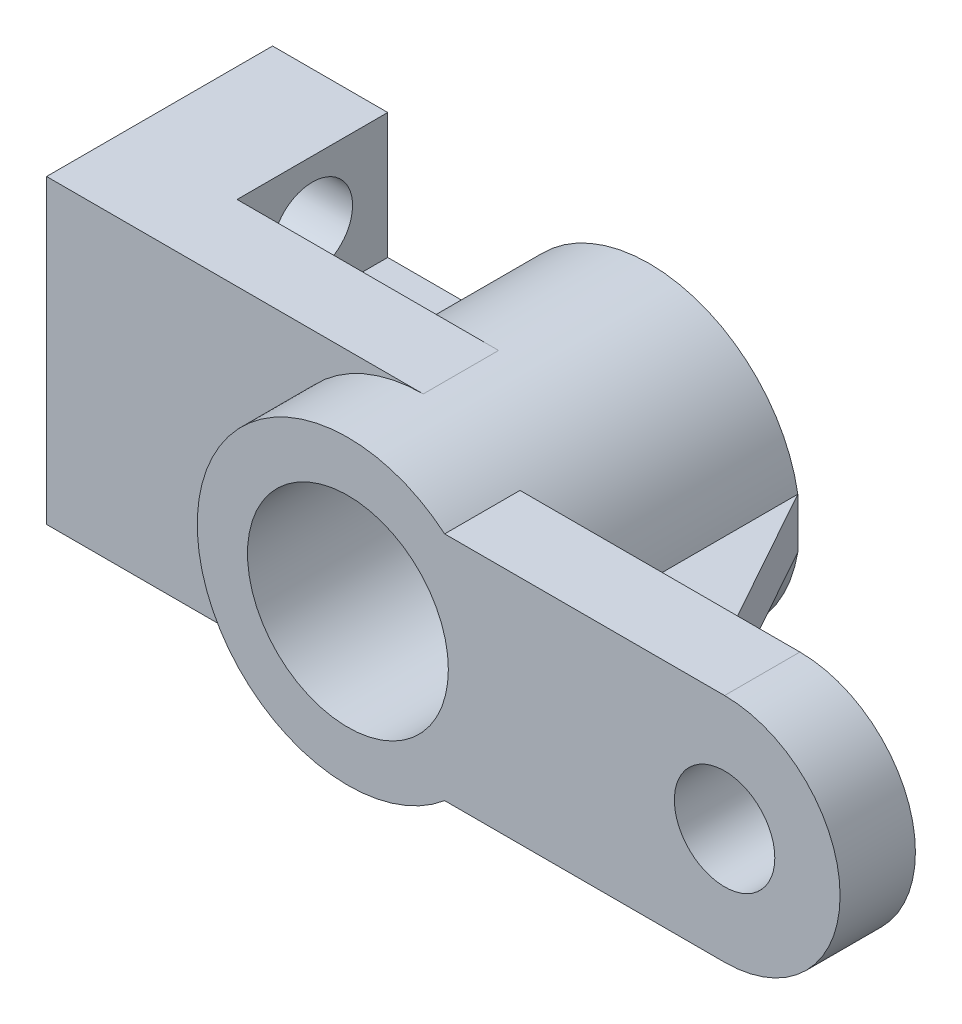
ISO-10303-21;
HEADER;
FILE_DESCRIPTION(('STEP AP214'),'2;1');
FILE_NAME('part.step','',(''),(''),'','','');
FILE_SCHEMA(('AUTOMOTIVE_DESIGN { 1 0 10303 214 1 1 1 1 }'));
ENDSEC;
DATA;
#1=APPLICATION_CONTEXT('core data for automotive mechanical design processes');
#2=APPLICATION_PROTOCOL_DEFINITION('international standard','automotive_design',2000,#1);
#3=PRODUCT_CONTEXT('',#1,'mechanical');
#4=PRODUCT('Part','Part','',(#3));
#5=PRODUCT_RELATED_PRODUCT_CATEGORY('part','',(#4));
#6=PRODUCT_DEFINITION_FORMATION('','',#4);
#7=PRODUCT_DEFINITION_CONTEXT('part definition',#1,'design');
#8=PRODUCT_DEFINITION('design','',#6,#7);
#9=PRODUCT_DEFINITION_SHAPE('','',#8);
#10=(LENGTH_UNIT() NAMED_UNIT(*) SI_UNIT(.MILLI.,.METRE.));
#11=(NAMED_UNIT(*) PLANE_ANGLE_UNIT() SI_UNIT($,.RADIAN.));
#12=(NAMED_UNIT(*) SI_UNIT($,.STERADIAN.) SOLID_ANGLE_UNIT());
#13=UNCERTAINTY_MEASURE_WITH_UNIT(LENGTH_MEASURE(1.E-05),#10,'distance_accuracy_value','');
#14=(GEOMETRIC_REPRESENTATION_CONTEXT(3) GLOBAL_UNCERTAINTY_ASSIGNED_CONTEXT((#13)) GLOBAL_UNIT_ASSIGNED_CONTEXT((#10,
#11,#12)) REPRESENTATION_CONTEXT('',''));
#15=CARTESIAN_POINT('',(0.,0.,0.));
#16=DIRECTION('',(0.,0.,1.));
#17=DIRECTION('',(1.,0.,0.));
#18=AXIS2_PLACEMENT_3D('',#15,#16,#17);
#19=CARTESIAN_POINT('',(0.,0.,60.));
#20=DIRECTION('',(0.,0.,-1.));
#21=DIRECTION('',(-1.,0.,0.));
#22=AXIS2_PLACEMENT_3D('',#19,#20,#21);
#23=CYLINDRICAL_SURFACE('',#22,30.);
#24=DIRECTION('',(0.,0.,1.));
#25=VECTOR('',#24,1.);
#26=CARTESIAN_POINT('',(29.5803989154981,5.,0.));
#27=LINE('',#26,#25);
#28=CARTESIAN_POINT('',(29.5803989154981,5.,0.));
#29=VERTEX_POINT('',#28);
#30=CARTESIAN_POINT('',(29.5803989154981,5.,45.));
#31=VERTEX_POINT('',#30);
#32=EDGE_CURVE('E165',#29,#31,#27,.T.);
#33=ORIENTED_EDGE('',*,*,#32,.F.);
#34=CARTESIAN_POINT('',(0.,0.,0.));
#35=DIRECTION('',(0.,0.,1.));
#36=DIRECTION('',(1.,0.,0.));
#37=AXIS2_PLACEMENT_3D('',#34,#35,#36);
#38=CIRCLE('',#37,30.);
#39=CARTESIAN_POINT('',(-29.5803989154981,5.,0.));
#40=VERTEX_POINT('',#39);
#41=EDGE_CURVE('E305',#29,#40,#38,.T.);
#42=ORIENTED_EDGE('',*,*,#41,.T.);
#43=DIRECTION('',(0.,0.,-1.));
#44=VECTOR('',#43,1.);
#45=CARTESIAN_POINT('',(-29.5803989154981,5.,105.252509344707));
#46=LINE('',#45,#44);
#47=CARTESIAN_POINT('',(-29.5803989154981,5.,30.));
#48=VERTEX_POINT('',#47);
#49=EDGE_CURVE('E225',#48,#40,#46,.T.);
#50=ORIENTED_EDGE('',*,*,#49,.F.);
#51=CARTESIAN_POINT('',(0.,0.,30.));
#52=DIRECTION('',(0.,0.,-1.));
#53=DIRECTION('',(1.,0.,0.));
#54=AXIS2_PLACEMENT_3D('',#51,#52,#53);
#55=CIRCLE('',#54,30.);
#56=CARTESIAN_POINT('',(-1.04744440165294E-13,30.,30.));
#57=VERTEX_POINT('',#56);
#58=EDGE_CURVE('E241',#48,#57,#55,.T.);
#59=ORIENTED_EDGE('',*,*,#58,.T.);
#60=DIRECTION('',(0.,0.,1.));
#61=VECTOR('',#60,1.);
#62=CARTESIAN_POINT('',(-1.04744440165294E-13,30.,30.));
#63=LINE('',#62,#61);
#64=CARTESIAN_POINT('',(-1.04744440165294E-13,30.,45.));
#65=VERTEX_POINT('',#64);
#66=EDGE_CURVE('E246',#57,#65,#63,.T.);
#67=ORIENTED_EDGE('',*,*,#66,.T.);
#68=CARTESIAN_POINT('',(0.,0.,45.));
#69=DIRECTION('',(0.,0.,-1.));
#70=DIRECTION('',(1.,0.,0.));
#71=AXIS2_PLACEMENT_3D('',#68,#69,#70);
#72=CIRCLE('',#71,30.);
#73=CARTESIAN_POINT('',(3.14233320495882E-13,-30.,45.));
#74=VERTEX_POINT('',#73);
#75=EDGE_CURVE('E216',#74,#65,#72,.T.);
#76=ORIENTED_EDGE('',*,*,#75,.F.);
#77=DIRECTION('',(0.,0.,1.));
#78=VECTOR('',#77,1.);
#79=CARTESIAN_POINT('',(3.14233320495882E-13,-30.,30.));
#80=LINE('',#79,#78);
#81=CARTESIAN_POINT('',(3.14233320495882E-13,-30.,30.));
#82=VERTEX_POINT('',#81);
#83=EDGE_CURVE('E257',#82,#74,#80,.T.);
#84=ORIENTED_EDGE('',*,*,#83,.F.);
#85=CARTESIAN_POINT('',(-29.5803989154981,-5.,30.));
#86=VERTEX_POINT('',#85);
#87=EDGE_CURVE('E238',#82,#86,#55,.T.);
#88=ORIENTED_EDGE('',*,*,#87,.T.);
#89=DIRECTION('',(0.,0.,-1.));
#90=VECTOR('',#89,1.);
#91=CARTESIAN_POINT('',(-29.5803989154981,-5.,105.252509344707));
#92=LINE('',#91,#90);
#93=CARTESIAN_POINT('',(-29.5803989154981,-5.,0.));
#94=VERTEX_POINT('',#93);
#95=EDGE_CURVE('E57',#86,#94,#92,.T.);
#96=ORIENTED_EDGE('',*,*,#95,.T.);
#97=CARTESIAN_POINT('',(29.5803989154981,-5.,0.));
#98=VERTEX_POINT('',#97);
#99=EDGE_CURVE('E38',#94,#98,#38,.T.);
#100=ORIENTED_EDGE('',*,*,#99,.T.);
#101=DIRECTION('',(0.,0.,1.));
#102=VECTOR('',#101,1.);
#103=CARTESIAN_POINT('',(29.5803989154981,-5.,0.));
#104=LINE('',#103,#102);
#105=CARTESIAN_POINT('',(29.5803989154981,-5.,45.));
#106=VERTEX_POINT('',#105);
#107=EDGE_CURVE('E168',#98,#106,#104,.T.);
#108=ORIENTED_EDGE('',*,*,#107,.T.);
#109=CARTESIAN_POINT('',(0.,0.,45.));
#110=DIRECTION('',(0.,0.,1.));
#111=DIRECTION('',(1.,0.,0.));
#112=AXIS2_PLACEMENT_3D('',#109,#110,#111);
#113=CIRCLE('',#112,30.);
#114=CARTESIAN_POINT('',(19.2613602842582,-23.,45.));
#115=VERTEX_POINT('',#114);
#116=EDGE_CURVE('E277',#115,#106,#113,.T.);
#117=ORIENTED_EDGE('',*,*,#116,.F.);
#118=DIRECTION('',(0.,0.,1.));
#119=VECTOR('',#118,1.);
#120=CARTESIAN_POINT('',(19.2613602842582,-23.,45.));
#121=LINE('',#120,#119);
#122=CARTESIAN_POINT('',(19.2613602842582,-23.,60.));
#123=VERTEX_POINT('',#122);
#124=EDGE_CURVE('E294',#115,#123,#121,.T.);
#125=ORIENTED_EDGE('',*,*,#124,.T.);
#126=CARTESIAN_POINT('',(0.,0.,60.));
#127=DIRECTION('',(0.,0.,1.));
#128=DIRECTION('',(1.,0.,0.));
#129=AXIS2_PLACEMENT_3D('',#126,#127,#128);
#130=CIRCLE('',#129,30.);
#131=CARTESIAN_POINT('',(19.2613602842582,23.,60.));
#132=VERTEX_POINT('',#131);
#133=EDGE_CURVE('E11',#132,#123,#130,.T.);
#134=ORIENTED_EDGE('',*,*,#133,.F.);
#135=DIRECTION('',(0.,0.,1.));
#136=VECTOR('',#135,1.);
#137=CARTESIAN_POINT('',(19.2613602842582,23.,45.));
#138=LINE('',#137,#136);
#139=CARTESIAN_POINT('',(19.2613602842582,23.,45.));
#140=VERTEX_POINT('',#139);
#141=EDGE_CURVE('E297',#140,#132,#138,.T.);
#142=ORIENTED_EDGE('',*,*,#141,.F.);
#143=EDGE_CURVE('E276',#31,#140,#113,.T.);
#144=ORIENTED_EDGE('',*,*,#143,.F.);
#145=EDGE_LOOP('',(#33,#42,#50,#59,#67,#76,#84,#88,#96,#100,#108,#117,#125,#134,#142,#144));
#146=FACE_BOUND('',#145,.T.);
#147=ADVANCED_FACE('F35',(#146),#23,.T.);
#148=CARTESIAN_POINT('',(0.,0.,45.));
#149=DIRECTION('',(0.,0.,1.));
#150=DIRECTION('',(1.,0.,0.));
#151=AXIS2_PLACEMENT_3D('',#148,#149,#150);
#152=PLANE('',#151);
#153=CARTESIAN_POINT('',(75.,0.,45.));
#154=DIRECTION('',(0.,0.,1.));
#155=DIRECTION('',(1.,0.,0.));
#156=AXIS2_PLACEMENT_3D('',#153,#154,#155);
#157=CIRCLE('',#156,9.99999999999999);
#158=CARTESIAN_POINT('',(85.,0.,45.));
#159=VERTEX_POINT('',#158);
#160=EDGE_CURVE('E267',#159,#159,#157,.T.);
#161=ORIENTED_EDGE('',*,*,#160,.T.);
#162=EDGE_LOOP('',(#161));
#163=FACE_BOUND('',#162,.T.);
#164=DIRECTION('',(1.,0.,0.));
#165=VECTOR('',#164,1.);
#166=CARTESIAN_POINT('',(29.5803989154981,5.,45.));
#167=LINE('',#166,#165);
#168=CARTESIAN_POINT('',(54.5803989154981,4.99999999999999,45.));
#169=VERTEX_POINT('',#168);
#170=EDGE_CURVE('E163',#31,#169,#167,.T.);
#171=ORIENTED_EDGE('',*,*,#170,.F.);
#172=ORIENTED_EDGE('',*,*,#143,.T.);
#173=DIRECTION('',(1.,0.,0.));
#174=VECTOR('',#173,1.);
#175=CARTESIAN_POINT('',(0.,23.,45.));
#176=LINE('',#175,#174);
#177=CARTESIAN_POINT('',(75.,23.,45.));
#178=VERTEX_POINT('',#177);
#179=EDGE_CURVE('E274',#140,#178,#176,.T.);
#180=ORIENTED_EDGE('',*,*,#179,.T.);
#181=CARTESIAN_POINT('',(75.,0.,45.));
#182=DIRECTION('',(0.,0.,1.));
#183=DIRECTION('',(1.,0.,0.));
#184=AXIS2_PLACEMENT_3D('',#181,#182,#183);
#185=CIRCLE('',#184,23.);
#186=CARTESIAN_POINT('',(75.,-23.,45.));
#187=VERTEX_POINT('',#186);
#188=EDGE_CURVE('E270',#178,#187,#185,.F.);
#189=ORIENTED_EDGE('',*,*,#188,.T.);
#190=DIRECTION('',(-1.,0.,0.));
#191=VECTOR('',#190,1.);
#192=CARTESIAN_POINT('',(0.,-23.,45.));
#193=LINE('',#192,#191);
#194=EDGE_CURVE('E279',#187,#115,#193,.T.);
#195=ORIENTED_EDGE('',*,*,#194,.T.);
#196=ORIENTED_EDGE('',*,*,#116,.T.);
#197=DIRECTION('',(1.,0.,0.));
#198=VECTOR('',#197,1.);
#199=CARTESIAN_POINT('',(29.5803989154981,-5.,45.));
#200=LINE('',#199,#198);
#201=CARTESIAN_POINT('',(54.5803989154981,-4.99999999999999,45.));
#202=VERTEX_POINT('',#201);
#203=EDGE_CURVE('E173',#106,#202,#200,.T.);
#204=ORIENTED_EDGE('',*,*,#203,.T.);
#205=DIRECTION('',(0.,1.,0.));
#206=VECTOR('',#205,1.);
#207=CARTESIAN_POINT('',(54.5803989154981,-4.99999999999999,45.));
#208=LINE('',#207,#206);
#209=EDGE_CURVE('E49',#202,#169,#208,.T.);
#210=ORIENTED_EDGE('',*,*,#209,.T.);
#211=EDGE_LOOP('',(#171,#172,#180,#189,#195,#196,#204,#210));
#212=FACE_BOUND('',#211,.T.);
#213=ADVANCED_FACE('F171',(#163,#212),#152,.F.);
#214=CARTESIAN_POINT('',(0.,0.,30.));
#215=DIRECTION('',(0.,0.,1.));
#216=DIRECTION('',(1.,0.,0.));
#217=AXIS2_PLACEMENT_3D('',#214,#215,#216);
#218=PLANE('',#217);
#219=DIRECTION('',(1.,0.,0.));
#220=VECTOR('',#219,1.);
#221=CARTESIAN_POINT('',(0.,5.,30.));
#222=LINE('',#221,#220);
#223=CARTESIAN_POINT('',(-52.0709417775426,5.00000000000001,30.));
#224=VERTEX_POINT('',#223);
#225=EDGE_CURVE('E222',#224,#48,#222,.T.);
#226=ORIENTED_EDGE('',*,*,#225,.F.);
#227=DIRECTION('',(0.,-1.,0.));
#228=VECTOR('',#227,1.);
#229=CARTESIAN_POINT('',(-52.0709417775426,0.,30.));
#230=LINE('',#229,#228);
#231=CARTESIAN_POINT('',(-52.0709417775426,30.,30.));
#232=VERTEX_POINT('',#231);
#233=EDGE_CURVE('E227',#232,#224,#230,.T.);
#234=ORIENTED_EDGE('',*,*,#233,.F.);
#235=DIRECTION('',(-1.,0.,0.));
#236=VECTOR('',#235,1.);
#237=CARTESIAN_POINT('',(-1.04744440165294E-13,30.,30.));
#238=LINE('',#237,#236);
#239=EDGE_CURVE('E240',#57,#232,#238,.T.);
#240=ORIENTED_EDGE('',*,*,#239,.F.);
#241=ORIENTED_EDGE('',*,*,#58,.F.);
#242=EDGE_LOOP('',(#226,#234,#240,#241));
#243=FACE_BOUND('',#242,.T.);
#244=ADVANCED_FACE('F331',(#243),#218,.F.);
#245=CARTESIAN_POINT('',(0.,0.,60.));
#246=DIRECTION('',(0.,0.,1.));
#247=DIRECTION('',(1.,0.,0.));
#248=AXIS2_PLACEMENT_3D('',#245,#246,#247);
#249=PLANE('',#248);
#250=ORIENTED_EDGE('',*,*,#133,.T.);
#251=DIRECTION('',(-1.,0.,0.));
#252=VECTOR('',#251,1.);
#253=CARTESIAN_POINT('',(0.,-23.,60.));
#254=LINE('',#253,#252);
#255=CARTESIAN_POINT('',(75.,-23.,60.));
#256=VERTEX_POINT('',#255);
#257=EDGE_CURVE('E271',#256,#123,#254,.T.);
#258=ORIENTED_EDGE('',*,*,#257,.F.);
#259=CARTESIAN_POINT('',(75.,0.,60.));
#260=DIRECTION('',(0.,0.,1.));
#261=DIRECTION('',(1.,0.,0.));
#262=AXIS2_PLACEMENT_3D('',#259,#260,#261);
#263=CIRCLE('',#262,23.);
#264=CARTESIAN_POINT('',(75.,23.,60.));
#265=VERTEX_POINT('',#264);
#266=EDGE_CURVE('E284',#265,#256,#263,.F.);
#267=ORIENTED_EDGE('',*,*,#266,.F.);
#268=DIRECTION('',(1.,0.,0.));
#269=VECTOR('',#268,1.);
#270=CARTESIAN_POINT('',(0.,23.,60.));
#271=LINE('',#270,#269);
#272=EDGE_CURVE('E287',#132,#265,#271,.T.);
#273=ORIENTED_EDGE('',*,*,#272,.F.);
#274=EDGE_LOOP('',(#250,#258,#267,#273));
#275=FACE_BOUND('',#274,.T.);
#276=CARTESIAN_POINT('',(0.,0.,60.));
#277=DIRECTION('',(0.,0.,1.));
#278=DIRECTION('',(1.,0.,0.));
#279=AXIS2_PLACEMENT_3D('',#276,#277,#278);
#280=CIRCLE('',#279,20.);
#281=CARTESIAN_POINT('',(20.,0.,60.));
#282=VERTEX_POINT('',#281);
#283=EDGE_CURVE('E302',#282,#282,#280,.T.);
#284=ORIENTED_EDGE('',*,*,#283,.F.);
#285=EDGE_LOOP('',(#284));
#286=FACE_BOUND('',#285,.T.);
#287=CARTESIAN_POINT('',(75.,0.,60.));
#288=DIRECTION('',(0.,0.,1.));
#289=DIRECTION('',(1.,0.,0.));
#290=AXIS2_PLACEMENT_3D('',#287,#288,#289);
#291=CIRCLE('',#290,9.99999999999999);
#292=CARTESIAN_POINT('',(85.,0.,60.));
#293=VERTEX_POINT('',#292);
#294=EDGE_CURVE('E260',#293,#293,#291,.T.);
#295=ORIENTED_EDGE('',*,*,#294,.F.);
#296=EDGE_LOOP('',(#295));
#297=FACE_BOUND('',#296,.T.);
#298=ADVANCED_FACE('F323',(#275,#286,#297),#249,.T.);
#299=CARTESIAN_POINT('',(0.,0.,0.));
#300=DIRECTION('',(0.,0.,1.));
#301=DIRECTION('',(1.,0.,0.));
#302=AXIS2_PLACEMENT_3D('',#299,#300,#301);
#303=PLANE('',#302);
#304=ORIENTED_EDGE('',*,*,#41,.F.);
#305=DIRECTION('',(0.,1.,0.));
#306=VECTOR('',#305,1.);
#307=CARTESIAN_POINT('',(29.5803989154981,-56.478150704935,0.));
#308=LINE('',#307,#306);
#309=EDGE_CURVE('E157',#98,#29,#308,.T.);
#310=ORIENTED_EDGE('',*,*,#309,.F.);
#311=ORIENTED_EDGE('',*,*,#99,.F.);
#312=DIRECTION('',(1.,0.,0.));
#313=VECTOR('',#312,1.);
#314=CARTESIAN_POINT('',(0.,-5.00000000000002,0.));
#315=LINE('',#314,#313);
#316=CARTESIAN_POINT('',(-52.0709417775426,-4.99999999999999,0.));
#317=VERTEX_POINT('',#316);
#318=EDGE_CURVE('E213',#317,#94,#315,.T.);
#319=ORIENTED_EDGE('',*,*,#318,.F.);
#320=DIRECTION('',(0.,-1.,0.));
#321=VECTOR('',#320,1.);
#322=CARTESIAN_POINT('',(-52.0709417775426,0.,0.));
#323=LINE('',#322,#321);
#324=CARTESIAN_POINT('',(-52.0709417775426,-30.,0.));
#325=VERTEX_POINT('',#324);
#326=EDGE_CURVE('E210',#317,#325,#323,.T.);
#327=ORIENTED_EDGE('',*,*,#326,.T.);
#328=DIRECTION('',(-1.,0.,0.));
#329=VECTOR('',#328,1.);
#330=CARTESIAN_POINT('',(0.,-30.,0.));
#331=LINE('',#330,#329);
#332=CARTESIAN_POINT('',(-74.9999999999993,-30.,0.));
#333=VERTEX_POINT('',#332);
#334=EDGE_CURVE('E207',#325,#333,#331,.T.);
#335=ORIENTED_EDGE('',*,*,#334,.T.);
#336=DIRECTION('',(0.,1.,0.));
#337=VECTOR('',#336,1.);
#338=CARTESIAN_POINT('',(-74.9999999999993,0.,0.));
#339=LINE('',#338,#337);
#340=CARTESIAN_POINT('',(-74.9999999999993,30.,0.));
#341=VERTEX_POINT('',#340);
#342=EDGE_CURVE('E204',#333,#341,#339,.T.);
#343=ORIENTED_EDGE('',*,*,#342,.T.);
#344=DIRECTION('',(1.,0.,0.));
#345=VECTOR('',#344,1.);
#346=CARTESIAN_POINT('',(0.,30.0000000000001,0.));
#347=LINE('',#346,#345);
#348=CARTESIAN_POINT('',(-52.0709417775426,30.,0.));
#349=VERTEX_POINT('',#348);
#350=EDGE_CURVE('E201',#341,#349,#347,.T.);
#351=ORIENTED_EDGE('',*,*,#350,.T.);
#352=DIRECTION('',(0.,-1.,0.));
#353=VECTOR('',#352,1.);
#354=CARTESIAN_POINT('',(-52.0709417775426,0.,0.));
#355=LINE('',#354,#353);
#356=CARTESIAN_POINT('',(-52.0709417775426,5.00000000000001,0.));
#357=VERTEX_POINT('',#356);
#358=EDGE_CURVE('E198',#349,#357,#355,.T.);
#359=ORIENTED_EDGE('',*,*,#358,.T.);
#360=DIRECTION('',(1.,0.,0.));
#361=VECTOR('',#360,1.);
#362=CARTESIAN_POINT('',(0.,5.,0.));
#363=LINE('',#362,#361);
#364=EDGE_CURVE('E194',#357,#40,#363,.T.);
#365=ORIENTED_EDGE('',*,*,#364,.T.);
#366=EDGE_LOOP('',(#304,#310,#311,#319,#327,#335,#343,#351,#359,#365));
#367=FACE_BOUND('',#366,.T.);
#368=CARTESIAN_POINT('',(0.,0.,0.));
#369=DIRECTION('',(0.,0.,1.));
#370=DIRECTION('',(1.,0.,0.));
#371=AXIS2_PLACEMENT_3D('',#368,#369,#370);
#372=CIRCLE('',#371,20.);
#373=CARTESIAN_POINT('',(20.,0.,0.));
#374=VERTEX_POINT('',#373);
#375=EDGE_CURVE('E293',#374,#374,#372,.T.);
#376=ORIENTED_EDGE('',*,*,#375,.T.);
#377=EDGE_LOOP('',(#376));
#378=FACE_BOUND('',#377,.T.);
#379=ADVANCED_FACE('F309',(#367,#378),#303,.F.);
#380=CARTESIAN_POINT('',(0.,0.,60.));
#381=DIRECTION('',(0.,0.,-1.));
#382=DIRECTION('',(-1.,0.,0.));
#383=AXIS2_PLACEMENT_3D('',#380,#381,#382);
#384=CYLINDRICAL_SURFACE('',#383,20.);
#385=ORIENTED_EDGE('',*,*,#283,.T.);
#386=EDGE_LOOP('',(#385));
#387=FACE_BOUND('',#386,.T.);
#388=ORIENTED_EDGE('',*,*,#375,.F.);
#389=EDGE_LOOP('',(#388));
#390=FACE_BOUND('',#389,.T.);
#391=ADVANCED_FACE('F311',(#387,#390),#384,.F.);
#392=CARTESIAN_POINT('',(75.,0.,45.));
#393=DIRECTION('',(0.,0.,1.));
#394=DIRECTION('',(1.,0.,0.));
#395=AXIS2_PLACEMENT_3D('',#392,#393,#394);
#396=CYLINDRICAL_SURFACE('',#395,23.);
#397=ORIENTED_EDGE('',*,*,#266,.T.);
#398=DIRECTION('',(0.,0.,1.));
#399=VECTOR('',#398,1.);
#400=CARTESIAN_POINT('',(75.,-23.,45.));
#401=LINE('',#400,#399);
#402=EDGE_CURVE('E290',#187,#256,#401,.T.);
#403=ORIENTED_EDGE('',*,*,#402,.F.);
#404=ORIENTED_EDGE('',*,*,#188,.F.);
#405=DIRECTION('',(0.,0.,1.));
#406=VECTOR('',#405,1.);
#407=CARTESIAN_POINT('',(75.,23.,45.));
#408=LINE('',#407,#406);
#409=EDGE_CURVE('E281',#178,#265,#408,.T.);
#410=ORIENTED_EDGE('',*,*,#409,.T.);
#411=EDGE_LOOP('',(#397,#403,#404,#410));
#412=FACE_BOUND('',#411,.T.);
#413=ADVANCED_FACE('F313',(#412),#396,.T.);
#414=CARTESIAN_POINT('',(0.,-23.,45.));
#415=DIRECTION('',(0.,1.,0.));
#416=DIRECTION('',(-1.,0.,0.));
#417=AXIS2_PLACEMENT_3D('',#414,#415,#416);
#418=PLANE('',#417);
#419=ORIENTED_EDGE('',*,*,#257,.T.);
#420=ORIENTED_EDGE('',*,*,#124,.F.);
#421=ORIENTED_EDGE('',*,*,#194,.F.);
#422=ORIENTED_EDGE('',*,*,#402,.T.);
#423=EDGE_LOOP('',(#419,#420,#421,#422));
#424=FACE_BOUND('',#423,.T.);
#425=ADVANCED_FACE('F320',(#424),#418,.F.);
#426=CARTESIAN_POINT('',(75.,0.,45.));
#427=DIRECTION('',(0.,0.,1.));
#428=DIRECTION('',(1.,0.,0.));
#429=AXIS2_PLACEMENT_3D('',#426,#427,#428);
#430=CYLINDRICAL_SURFACE('',#429,9.99999999999999);
#431=ORIENTED_EDGE('',*,*,#160,.F.);
#432=EDGE_LOOP('',(#431));
#433=FACE_BOUND('',#432,.T.);
#434=ORIENTED_EDGE('',*,*,#294,.T.);
#435=EDGE_LOOP('',(#434));
#436=FACE_BOUND('',#435,.T.);
#437=ADVANCED_FACE('F399',(#433,#436),#430,.F.);
#438=CARTESIAN_POINT('',(0.,23.,45.));
#439=DIRECTION('',(0.,-1.,0.));
#440=DIRECTION('',(1.,0.,0.));
#441=AXIS2_PLACEMENT_3D('',#438,#439,#440);
#442=PLANE('',#441);
#443=ORIENTED_EDGE('',*,*,#272,.T.);
#444=ORIENTED_EDGE('',*,*,#409,.F.);
#445=ORIENTED_EDGE('',*,*,#179,.F.);
#446=ORIENTED_EDGE('',*,*,#141,.T.);
#447=EDGE_LOOP('',(#443,#444,#445,#446));
#448=FACE_BOUND('',#447,.T.);
#449=ADVANCED_FACE('F401',(#448),#442,.F.);
#450=CARTESIAN_POINT('',(3.14233320495882E-13,-30.,30.));
#451=DIRECTION('',(0.,-1.,0.));
#452=DIRECTION('',(1.,0.,0.));
#453=AXIS2_PLACEMENT_3D('',#450,#451,#452);
#454=PLANE('',#453);
#455=DIRECTION('',(1.,0.,0.));
#456=VECTOR('',#455,1.);
#457=CARTESIAN_POINT('',(3.14233320495882E-13,-30.,45.));
#458=LINE('',#457,#456);
#459=CARTESIAN_POINT('',(-74.9999999999993,-30.,45.));
#460=VERTEX_POINT('',#459);
#461=EDGE_CURVE('E255',#460,#74,#458,.T.);
#462=ORIENTED_EDGE('',*,*,#461,.F.);
#463=DIRECTION('',(0.,0.,1.));
#464=VECTOR('',#463,1.);
#465=CARTESIAN_POINT('',(-74.9999999999993,-30.,30.));
#466=LINE('',#465,#464);
#467=EDGE_CURVE('E261',#333,#460,#466,.T.);
#468=ORIENTED_EDGE('',*,*,#467,.F.);
#469=ORIENTED_EDGE('',*,*,#334,.F.);
#470=DIRECTION('',(0.,0.,-1.));
#471=VECTOR('',#470,1.);
#472=CARTESIAN_POINT('',(-52.0709417775426,-30.,105.252509344707));
#473=LINE('',#472,#471);
#474=CARTESIAN_POINT('',(-52.0709417775426,-30.,30.));
#475=VERTEX_POINT('',#474);
#476=EDGE_CURVE('E220',#475,#325,#473,.T.);
#477=ORIENTED_EDGE('',*,*,#476,.F.);
#478=DIRECTION('',(1.,0.,0.));
#479=VECTOR('',#478,1.);
#480=CARTESIAN_POINT('',(3.14233320495882E-13,-30.,30.));
#481=LINE('',#480,#479);
#482=EDGE_CURVE('E244',#475,#82,#481,.T.);
#483=ORIENTED_EDGE('',*,*,#482,.T.);
#484=ORIENTED_EDGE('',*,*,#83,.T.);
#485=EDGE_LOOP('',(#462,#468,#469,#477,#483,#484));
#486=FACE_BOUND('',#485,.T.);
#487=ADVANCED_FACE('F352',(#486),#454,.T.);
#488=CARTESIAN_POINT('',(-74.9999999999993,30.,30.));
#489=DIRECTION('',(-1.,0.,0.));
#490=DIRECTION('',(0.,-1.,0.));
#491=AXIS2_PLACEMENT_3D('',#488,#489,#490);
#492=PLANE('',#491);
#493=CARTESIAN_POINT('',(-74.9999999999993,-17.5,15.));
#494=DIRECTION('',(-1.,0.,0.));
#495=DIRECTION('',(0.,-1.,0.));
#496=AXIS2_PLACEMENT_3D('',#493,#494,#495);
#497=CIRCLE('',#496,8.);
#498=CARTESIAN_POINT('',(-74.9999999999993,-25.5,15.));
#499=VERTEX_POINT('',#498);
#500=EDGE_CURVE('E182',#499,#499,#497,.T.);
#501=ORIENTED_EDGE('',*,*,#500,.F.);
#502=EDGE_LOOP('',(#501));
#503=FACE_BOUND('',#502,.T.);
#504=CARTESIAN_POINT('',(-74.9999999999993,17.5,15.));
#505=DIRECTION('',(-1.,0.,0.));
#506=DIRECTION('',(0.,1.,0.));
#507=AXIS2_PLACEMENT_3D('',#504,#505,#506);
#508=CIRCLE('',#507,7.99999999999999);
#509=CARTESIAN_POINT('',(-74.9999999999993,25.5,15.));
#510=VERTEX_POINT('',#509);
#511=EDGE_CURVE('E179',#510,#510,#508,.T.);
#512=ORIENTED_EDGE('',*,*,#511,.F.);
#513=EDGE_LOOP('',(#512));
#514=FACE_BOUND('',#513,.T.);
#515=DIRECTION('',(0.,-1.,0.));
#516=VECTOR('',#515,1.);
#517=CARTESIAN_POINT('',(-74.9999999999993,30.,45.));
#518=LINE('',#517,#516);
#519=CARTESIAN_POINT('',(-74.9999999999993,30.,45.));
#520=VERTEX_POINT('',#519);
#521=EDGE_CURVE('E252',#520,#460,#518,.T.);
#522=ORIENTED_EDGE('',*,*,#521,.F.);
#523=DIRECTION('',(0.,0.,1.));
#524=VECTOR('',#523,1.);
#525=CARTESIAN_POINT('',(-74.9999999999993,30.,30.));
#526=LINE('',#525,#524);
#527=EDGE_CURVE('E263',#341,#520,#526,.T.);
#528=ORIENTED_EDGE('',*,*,#527,.F.);
#529=ORIENTED_EDGE('',*,*,#342,.F.);
#530=ORIENTED_EDGE('',*,*,#467,.T.);
#531=EDGE_LOOP('',(#522,#528,#529,#530));
#532=FACE_BOUND('',#531,.T.);
#533=ADVANCED_FACE('F355',(#503,#514,#532),#492,.T.);
#534=CARTESIAN_POINT('',(-1.04744440165294E-13,30.,30.));
#535=DIRECTION('',(0.,1.,0.));
#536=DIRECTION('',(-1.,0.,0.));
#537=AXIS2_PLACEMENT_3D('',#534,#535,#536);
#538=PLANE('',#537);
#539=DIRECTION('',(-1.,0.,0.));
#540=VECTOR('',#539,1.);
#541=CARTESIAN_POINT('',(-1.04744440165294E-13,30.,45.));
#542=LINE('',#541,#540);
#543=EDGE_CURVE('E249',#65,#520,#542,.T.);
#544=ORIENTED_EDGE('',*,*,#543,.F.);
#545=ORIENTED_EDGE('',*,*,#66,.F.);
#546=ORIENTED_EDGE('',*,*,#239,.T.);
#547=DIRECTION('',(0.,0.,-1.));
#548=VECTOR('',#547,1.);
#549=CARTESIAN_POINT('',(-52.0709417775426,30.,105.252509344707));
#550=LINE('',#549,#548);
#551=EDGE_CURVE('E230',#232,#349,#550,.T.);
#552=ORIENTED_EDGE('',*,*,#551,.T.);
#553=ORIENTED_EDGE('',*,*,#350,.F.);
#554=ORIENTED_EDGE('',*,*,#527,.T.);
#555=EDGE_LOOP('',(#544,#545,#546,#552,#553,#554));
#556=FACE_BOUND('',#555,.T.);
#557=ADVANCED_FACE('F358',(#556),#538,.T.);
#558=ORIENTED_EDGE('',*,*,#482,.F.);
#559=DIRECTION('',(0.,-1.,0.));
#560=VECTOR('',#559,1.);
#561=CARTESIAN_POINT('',(-52.0709417775426,0.,30.));
#562=LINE('',#561,#560);
#563=CARTESIAN_POINT('',(-52.0709417775426,-4.99999999999999,30.));
#564=VERTEX_POINT('',#563);
#565=EDGE_CURVE('E197',#564,#475,#562,.T.);
#566=ORIENTED_EDGE('',*,*,#565,.F.);
#567=DIRECTION('',(1.,0.,0.));
#568=VECTOR('',#567,1.);
#569=CARTESIAN_POINT('',(0.,-5.00000000000002,30.));
#570=LINE('',#569,#568);
#571=EDGE_CURVE('E189',#564,#86,#570,.T.);
#572=ORIENTED_EDGE('',*,*,#571,.T.);
#573=ORIENTED_EDGE('',*,*,#87,.F.);
#574=EDGE_LOOP('',(#558,#566,#572,#573));
#575=FACE_BOUND('',#574,.T.);
#576=ADVANCED_FACE('F376',(#575),#218,.F.);
#577=CARTESIAN_POINT('',(0.,0.,45.));
#578=DIRECTION('',(0.,0.,1.));
#579=DIRECTION('',(1.,0.,0.));
#580=AXIS2_PLACEMENT_3D('',#577,#578,#579);
#581=PLANE('',#580);
#582=ORIENTED_EDGE('',*,*,#75,.T.);
#583=ORIENTED_EDGE('',*,*,#543,.T.);
#584=ORIENTED_EDGE('',*,*,#521,.T.);
#585=ORIENTED_EDGE('',*,*,#461,.T.);
#586=EDGE_LOOP('',(#582,#583,#584,#585));
#587=FACE_BOUND('',#586,.T.);
#588=ADVANCED_FACE('F373',(#587),#581,.T.);
#589=CARTESIAN_POINT('',(-52.0709417775426,0.,105.252509344707));
#590=DIRECTION('',(1.,0.,0.));
#591=DIRECTION('',(0.,0.,-1.));
#592=AXIS2_PLACEMENT_3D('',#589,#590,#591);
#593=PLANE('',#592);
#594=CARTESIAN_POINT('',(-52.0709417775426,-17.5,15.));
#595=DIRECTION('',(1.,0.,0.));
#596=DIRECTION('',(0.,1.,0.));
#597=AXIS2_PLACEMENT_3D('',#594,#595,#596);
#598=CIRCLE('',#597,8.);
#599=CARTESIAN_POINT('',(-52.0709417775426,-9.50000000000001,15.));
#600=VERTEX_POINT('',#599);
#601=EDGE_CURVE('E185',#600,#600,#598,.F.);
#602=ORIENTED_EDGE('',*,*,#601,.T.);
#603=EDGE_LOOP('',(#602));
#604=FACE_BOUND('',#603,.T.);
#605=DIRECTION('',(0.,0.,-1.));
#606=VECTOR('',#605,1.);
#607=CARTESIAN_POINT('',(-52.0709417775426,-4.99999999999999,105.252509344707));
#608=LINE('',#607,#606);
#609=EDGE_CURVE('E217',#564,#317,#608,.T.);
#610=ORIENTED_EDGE('',*,*,#609,.F.);
#611=ORIENTED_EDGE('',*,*,#565,.T.);
#612=ORIENTED_EDGE('',*,*,#476,.T.);
#613=ORIENTED_EDGE('',*,*,#326,.F.);
#614=EDGE_LOOP('',(#610,#611,#612,#613));
#615=FACE_BOUND('',#614,.T.);
#616=ADVANCED_FACE('F346',(#604,#615),#593,.T.);
#617=CARTESIAN_POINT('',(-52.0709417775426,0.,105.252509344707));
#618=DIRECTION('',(1.,0.,0.));
#619=DIRECTION('',(0.,1.,0.));
#620=AXIS2_PLACEMENT_3D('',#617,#618,#619);
#621=PLANE('',#620);
#622=CARTESIAN_POINT('',(-52.0709417775426,17.5,15.));
#623=DIRECTION('',(1.,0.,0.));
#624=DIRECTION('',(0.,1.,0.));
#625=AXIS2_PLACEMENT_3D('',#622,#623,#624);
#626=CIRCLE('',#625,7.99999999999999);
#627=CARTESIAN_POINT('',(-52.0709417775426,25.5,15.));
#628=VERTEX_POINT('',#627);
#629=EDGE_CURVE('E186',#628,#628,#626,.F.);
#630=ORIENTED_EDGE('',*,*,#629,.T.);
#631=EDGE_LOOP('',(#630));
#632=FACE_BOUND('',#631,.T.);
#633=ORIENTED_EDGE('',*,*,#551,.F.);
#634=ORIENTED_EDGE('',*,*,#233,.T.);
#635=DIRECTION('',(0.,0.,-1.));
#636=VECTOR('',#635,1.);
#637=CARTESIAN_POINT('',(-52.0709417775426,5.00000000000001,105.252509344707));
#638=LINE('',#637,#636);
#639=EDGE_CURVE('E226',#224,#357,#638,.T.);
#640=ORIENTED_EDGE('',*,*,#639,.T.);
#641=ORIENTED_EDGE('',*,*,#358,.F.);
#642=EDGE_LOOP('',(#633,#634,#640,#641));
#643=FACE_BOUND('',#642,.T.);
#644=ADVANCED_FACE('F362',(#632,#643),#621,.T.);
#645=CARTESIAN_POINT('',(0.,5.,105.252509344707));
#646=DIRECTION('',(0.,1.,0.));
#647=DIRECTION('',(-1.,0.,0.));
#648=AXIS2_PLACEMENT_3D('',#645,#646,#647);
#649=PLANE('',#648);
#650=ORIENTED_EDGE('',*,*,#639,.F.);
#651=ORIENTED_EDGE('',*,*,#225,.T.);
#652=ORIENTED_EDGE('',*,*,#49,.T.);
#653=ORIENTED_EDGE('',*,*,#364,.F.);
#654=EDGE_LOOP('',(#650,#651,#652,#653));
#655=FACE_BOUND('',#654,.T.);
#656=ADVANCED_FACE('F365',(#655),#649,.T.);
#657=CARTESIAN_POINT('',(0.,-5.00000000000002,105.252509344707));
#658=DIRECTION('',(0.,1.,0.));
#659=DIRECTION('',(-1.,0.,0.));
#660=AXIS2_PLACEMENT_3D('',#657,#658,#659);
#661=PLANE('',#660);
#662=ORIENTED_EDGE('',*,*,#571,.F.);
#663=ORIENTED_EDGE('',*,*,#609,.T.);
#664=ORIENTED_EDGE('',*,*,#318,.T.);
#665=ORIENTED_EDGE('',*,*,#95,.F.);
#666=EDGE_LOOP('',(#662,#663,#664,#665));
#667=FACE_BOUND('',#666,.T.);
#668=ADVANCED_FACE('F343',(#667),#661,.F.);
#669=CARTESIAN_POINT('',(-29.4435247795731,17.5,15.));
#670=DIRECTION('',(-1.,0.,0.));
#671=DIRECTION('',(0.,-1.,0.));
#672=AXIS2_PLACEMENT_3D('',#669,#670,#671);
#673=CYLINDRICAL_SURFACE('',#672,7.99999999999999);
#674=ORIENTED_EDGE('',*,*,#511,.T.);
#675=EDGE_LOOP('',(#674));
#676=FACE_BOUND('',#675,.T.);
#677=ORIENTED_EDGE('',*,*,#629,.F.);
#678=EDGE_LOOP('',(#677));
#679=FACE_BOUND('',#678,.T.);
#680=ADVANCED_FACE('F455',(#676,#679),#673,.F.);
#681=CARTESIAN_POINT('',(-29.4435247795731,-17.5,15.));
#682=DIRECTION('',(-1.,0.,0.));
#683=DIRECTION('',(0.,-1.,0.));
#684=AXIS2_PLACEMENT_3D('',#681,#682,#683);
#685=CYLINDRICAL_SURFACE('',#684,8.);
#686=ORIENTED_EDGE('',*,*,#500,.T.);
#687=EDGE_LOOP('',(#686));
#688=FACE_BOUND('',#687,.T.);
#689=ORIENTED_EDGE('',*,*,#601,.F.);
#690=EDGE_LOOP('',(#689));
#691=FACE_BOUND('',#690,.T.);
#692=ADVANCED_FACE('F465',(#688,#691),#685,.F.);
#693=CARTESIAN_POINT('',(29.5803989154981,5.,0.));
#694=DIRECTION('',(0.,-1.,0.));
#695=DIRECTION('',(1.,0.,0.));
#696=AXIS2_PLACEMENT_3D('',#693,#694,#695);
#697=PLANE('',#696);
#698=ORIENTED_EDGE('',*,*,#170,.T.);
#699=DIRECTION('',(0.485642931178632,0.,0.874157276121538));
#700=VECTOR('',#699,1.);
#701=CARTESIAN_POINT('',(29.5803989154981,5.,0.));
#702=LINE('',#701,#700);
#703=EDGE_CURVE('E153',#29,#169,#702,.T.);
#704=ORIENTED_EDGE('',*,*,#703,.F.);
#705=ORIENTED_EDGE('',*,*,#32,.T.);
#706=EDGE_LOOP('',(#698,#704,#705));
#707=FACE_BOUND('',#706,.T.);
#708=ADVANCED_FACE('F164',(#707),#697,.F.);
#709=CARTESIAN_POINT('',(29.5803989154981,-5.,0.));
#710=DIRECTION('',(0.,-1.,0.));
#711=DIRECTION('',(1.,0.,0.));
#712=AXIS2_PLACEMENT_3D('',#709,#710,#711);
#713=PLANE('',#712);
#714=DIRECTION('',(0.485642931178632,0.,0.874157276121538));
#715=VECTOR('',#714,1.);
#716=CARTESIAN_POINT('',(29.5803989154981,-5.,0.));
#717=LINE('',#716,#715);
#718=EDGE_CURVE('E160',#98,#202,#717,.T.);
#719=ORIENTED_EDGE('',*,*,#718,.T.);
#720=ORIENTED_EDGE('',*,*,#203,.F.);
#721=ORIENTED_EDGE('',*,*,#107,.F.);
#722=EDGE_LOOP('',(#719,#720,#721));
#723=FACE_BOUND('',#722,.T.);
#724=ADVANCED_FACE('F480',(#723),#713,.T.);
#725=CARTESIAN_POINT('',(29.5803989154981,-56.478150704935,0.));
#726=DIRECTION('',(-0.874157276121538,0.,0.485642931178632));
#727=DIRECTION('',(0.485642931178632,0.,0.874157276121538));
#728=AXIS2_PLACEMENT_3D('',#725,#726,#727);
#729=PLANE('',#728);
#730=ORIENTED_EDGE('',*,*,#309,.T.);
#731=ORIENTED_EDGE('',*,*,#703,.T.);
#732=ORIENTED_EDGE('',*,*,#209,.F.);
#733=ORIENTED_EDGE('',*,*,#718,.F.);
#734=EDGE_LOOP('',(#730,#731,#732,#733));
#735=FACE_BOUND('',#734,.T.);
#736=ADVANCED_FACE('F155',(#735),#729,.F.);
#737=CLOSED_SHELL('',(#147,#213,#244,#298,#379,#391,#413,#425,#437,#449,#487,#533,#557,#576,
#588,#616,#644,#656,#668,#680,#692,#708,#724,#736));
#738=MANIFOLD_SOLID_BREP('B2',#737);
#739=ADVANCED_BREP_SHAPE_REPRESENTATION('',(#18,#738),#14);
#740=SHAPE_DEFINITION_REPRESENTATION(#9,#739);
ENDSEC;
END-ISO-10303-21;
